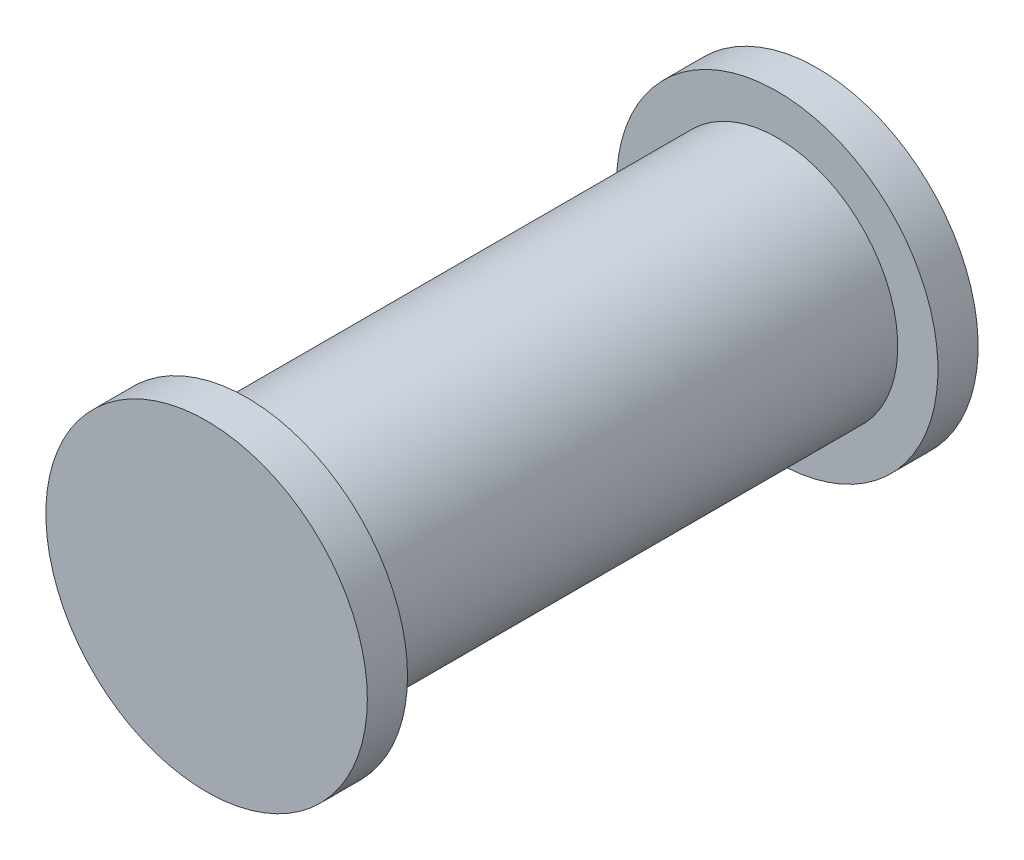
ISO-10303-21;
HEADER;
FILE_DESCRIPTION(('STEP AP214'),'2;1');
FILE_NAME('part.step','',(''),(''),'','','');
FILE_SCHEMA(('AUTOMOTIVE_DESIGN { 1 0 10303 214 1 1 1 1 }'));
ENDSEC;
DATA;
#1=APPLICATION_CONTEXT('core data for automotive mechanical design processes');
#2=APPLICATION_PROTOCOL_DEFINITION('international standard','automotive_design',2000,#1);
#3=PRODUCT_CONTEXT('',#1,'mechanical');
#4=PRODUCT('Part','Part','',(#3));
#5=PRODUCT_RELATED_PRODUCT_CATEGORY('part','',(#4));
#6=PRODUCT_DEFINITION_FORMATION('','',#4);
#7=PRODUCT_DEFINITION_CONTEXT('part definition',#1,'design');
#8=PRODUCT_DEFINITION('design','',#6,#7);
#9=PRODUCT_DEFINITION_SHAPE('','',#8);
#10=(LENGTH_UNIT() NAMED_UNIT(*) SI_UNIT(.MILLI.,.METRE.));
#11=(NAMED_UNIT(*) PLANE_ANGLE_UNIT() SI_UNIT($,.RADIAN.));
#12=(NAMED_UNIT(*) SI_UNIT($,.STERADIAN.) SOLID_ANGLE_UNIT());
#13=UNCERTAINTY_MEASURE_WITH_UNIT(LENGTH_MEASURE(1.E-05),#10,'distance_accuracy_value','');
#14=(GEOMETRIC_REPRESENTATION_CONTEXT(3) GLOBAL_UNCERTAINTY_ASSIGNED_CONTEXT((#13)) GLOBAL_UNIT_ASSIGNED_CONTEXT((#10,
#11,#12)) REPRESENTATION_CONTEXT('',''));
#15=CARTESIAN_POINT('',(0.,0.,0.));
#16=DIRECTION('',(0.,0.,1.));
#17=DIRECTION('',(1.,0.,0.));
#18=AXIS2_PLACEMENT_3D('',#15,#16,#17);
#19=CARTESIAN_POINT('',(0.,0.,45.54));
#20=DIRECTION('',(0.,0.,-1.));
#21=DIRECTION('',(-1.,0.,0.));
#22=AXIS2_PLACEMENT_3D('',#19,#20,#21);
#23=CYLINDRICAL_SURFACE('',#22,10.35);
#24=CARTESIAN_POINT('',(0.,0.,45.54));
#25=DIRECTION('',(0.,0.,1.));
#26=DIRECTION('',(1.,0.,0.));
#27=AXIS2_PLACEMENT_3D('',#24,#25,#26);
#28=CIRCLE('',#27,10.35);
#29=CARTESIAN_POINT('',(10.35,0.,45.54));
#30=VERTEX_POINT('',#29);
#31=EDGE_CURVE('E10',#30,#30,#28,.T.);
#32=ORIENTED_EDGE('',*,*,#31,.F.);
#33=EDGE_LOOP('',(#32));
#34=FACE_BOUND('',#33,.T.);
#35=CARTESIAN_POINT('',(0.,0.,0.));
#36=DIRECTION('',(0.,0.,-1.));
#37=DIRECTION('',(-1.,0.,0.));
#38=AXIS2_PLACEMENT_3D('',#35,#36,#37);
#39=CIRCLE('',#38,10.35);
#40=CARTESIAN_POINT('',(-10.35,0.,0.));
#41=VERTEX_POINT('',#40);
#42=EDGE_CURVE('E46',#41,#41,#39,.T.);
#43=ORIENTED_EDGE('',*,*,#42,.F.);
#44=EDGE_LOOP('',(#43));
#45=FACE_BOUND('',#44,.T.);
#46=ADVANCED_FACE('F31',(#34,#45),#23,.T.);
#47=CARTESIAN_POINT('',(0.,0.,45.54));
#48=DIRECTION('',(0.,0.,1.));
#49=DIRECTION('',(1.,0.,0.));
#50=AXIS2_PLACEMENT_3D('',#47,#48,#49);
#51=PLANE('',#50);
#52=CARTESIAN_POINT('',(0.,0.,45.54));
#53=DIRECTION('',(0.,0.,1.));
#54=DIRECTION('',(1.,0.,0.));
#55=AXIS2_PLACEMENT_3D('',#52,#53,#54);
#56=CIRCLE('',#55,13.8);
#57=CARTESIAN_POINT('',(13.8,0.,45.54));
#58=VERTEX_POINT('',#57);
#59=EDGE_CURVE('E41',#58,#58,#56,.T.);
#60=ORIENTED_EDGE('',*,*,#59,.F.);
#61=EDGE_LOOP('',(#60));
#62=FACE_BOUND('',#61,.T.);
#63=ORIENTED_EDGE('',*,*,#31,.T.);
#64=EDGE_LOOP('',(#63));
#65=FACE_BOUND('',#64,.T.);
#66=ADVANCED_FACE('F73',(#62,#65),#51,.F.);
#67=CARTESIAN_POINT('',(0.,0.,48.99));
#68=DIRECTION('',(0.,0.,-1.));
#69=DIRECTION('',(-1.,0.,0.));
#70=AXIS2_PLACEMENT_3D('',#67,#68,#69);
#71=CYLINDRICAL_SURFACE('',#70,13.8);
#72=CARTESIAN_POINT('',(0.,0.,48.99));
#73=DIRECTION('',(0.,0.,1.));
#74=DIRECTION('',(1.,0.,0.));
#75=AXIS2_PLACEMENT_3D('',#72,#73,#74);
#76=CIRCLE('',#75,13.8);
#77=CARTESIAN_POINT('',(13.8,0.,48.99));
#78=VERTEX_POINT('',#77);
#79=EDGE_CURVE('E37',#78,#78,#76,.T.);
#80=ORIENTED_EDGE('',*,*,#79,.F.);
#81=EDGE_LOOP('',(#80));
#82=FACE_BOUND('',#81,.T.);
#83=ORIENTED_EDGE('',*,*,#59,.T.);
#84=EDGE_LOOP('',(#83));
#85=FACE_BOUND('',#84,.T.);
#86=ADVANCED_FACE('F78',(#82,#85),#71,.T.);
#87=CARTESIAN_POINT('',(0.,0.,48.99));
#88=DIRECTION('',(0.,0.,1.));
#89=DIRECTION('',(1.,0.,0.));
#90=AXIS2_PLACEMENT_3D('',#87,#88,#89);
#91=PLANE('',#90);
#92=ORIENTED_EDGE('',*,*,#79,.T.);
#93=EDGE_LOOP('',(#92));
#94=FACE_BOUND('',#93,.T.);
#95=ADVANCED_FACE('F68',(#94),#91,.T.);
#96=CARTESIAN_POINT('',(0.,0.,0.));
#97=DIRECTION('',(0.,0.,-1.));
#98=DIRECTION('',(-1.,0.,0.));
#99=AXIS2_PLACEMENT_3D('',#96,#97,#98);
#100=PLANE('',#99);
#101=CARTESIAN_POINT('',(0.,0.,0.));
#102=DIRECTION('',(0.,0.,-1.));
#103=DIRECTION('',(-1.,0.,0.));
#104=AXIS2_PLACEMENT_3D('',#101,#102,#103);
#105=CIRCLE('',#104,13.8);
#106=CARTESIAN_POINT('',(-13.8,0.,0.));
#107=VERTEX_POINT('',#106);
#108=EDGE_CURVE('E51',#107,#107,#105,.T.);
#109=ORIENTED_EDGE('',*,*,#108,.F.);
#110=EDGE_LOOP('',(#109));
#111=FACE_BOUND('',#110,.T.);
#112=ORIENTED_EDGE('',*,*,#42,.T.);
#113=EDGE_LOOP('',(#112));
#114=FACE_BOUND('',#113,.T.);
#115=ADVANCED_FACE('F62',(#111,#114),#100,.F.);
#116=CARTESIAN_POINT('',(0.,0.,-3.45));
#117=DIRECTION('',(0.,0.,1.));
#118=DIRECTION('',(1.,0.,0.));
#119=AXIS2_PLACEMENT_3D('',#116,#117,#118);
#120=CYLINDRICAL_SURFACE('',#119,13.8);
#121=CARTESIAN_POINT('',(0.,0.,-3.45));
#122=DIRECTION('',(0.,0.,-1.));
#123=DIRECTION('',(-1.,0.,0.));
#124=AXIS2_PLACEMENT_3D('',#121,#122,#123);
#125=CIRCLE('',#124,13.8);
#126=CARTESIAN_POINT('',(-13.8,0.,-3.45));
#127=VERTEX_POINT('',#126);
#128=EDGE_CURVE('E50',#127,#127,#125,.T.);
#129=ORIENTED_EDGE('',*,*,#128,.F.);
#130=EDGE_LOOP('',(#129));
#131=FACE_BOUND('',#130,.T.);
#132=ORIENTED_EDGE('',*,*,#108,.T.);
#133=EDGE_LOOP('',(#132));
#134=FACE_BOUND('',#133,.T.);
#135=ADVANCED_FACE('F59',(#131,#134),#120,.T.);
#136=CARTESIAN_POINT('',(0.,0.,-3.45));
#137=DIRECTION('',(0.,0.,-1.));
#138=DIRECTION('',(-1.,0.,0.));
#139=AXIS2_PLACEMENT_3D('',#136,#137,#138);
#140=PLANE('',#139);
#141=ORIENTED_EDGE('',*,*,#128,.T.);
#142=EDGE_LOOP('',(#141));
#143=FACE_BOUND('',#142,.T.);
#144=ADVANCED_FACE('F57',(#143),#140,.T.);
#145=CLOSED_SHELL('',(#46,#66,#86,#95,#115,#135,#144));
#146=MANIFOLD_SOLID_BREP('B2',#145);
#147=ADVANCED_BREP_SHAPE_REPRESENTATION('',(#18,#146),#14);
#148=SHAPE_DEFINITION_REPRESENTATION(#9,#147);
ENDSEC;
END-ISO-10303-21;
